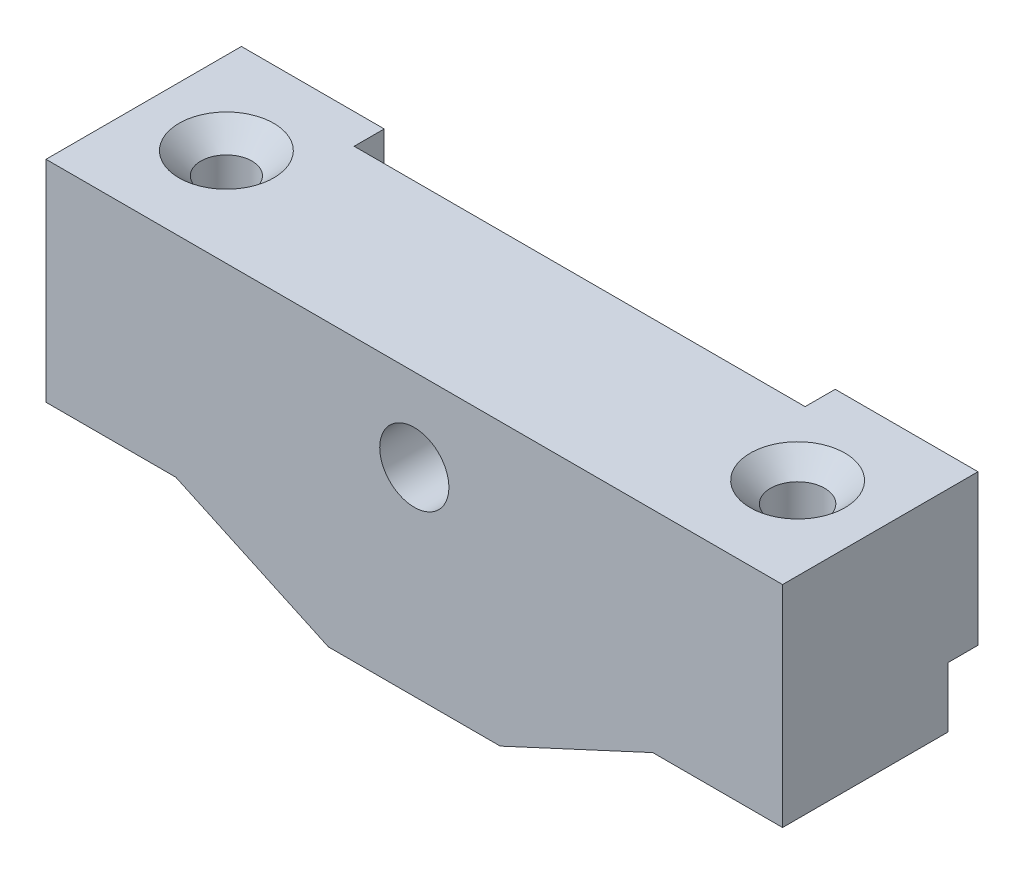
ISO-10303-21;
HEADER;
FILE_DESCRIPTION(('STEP AP214'),'2;1');
FILE_NAME('part.step','',(''),(''),'','','');
FILE_SCHEMA(('AUTOMOTIVE_DESIGN { 1 0 10303 214 1 1 1 1 }'));
ENDSEC;
DATA;
#1=APPLICATION_CONTEXT('core data for automotive mechanical design processes');
#2=APPLICATION_PROTOCOL_DEFINITION('international standard','automotive_design',2000,#1);
#3=PRODUCT_CONTEXT('',#1,'mechanical');
#4=PRODUCT('Part','Part','',(#3));
#5=PRODUCT_RELATED_PRODUCT_CATEGORY('part','',(#4));
#6=PRODUCT_DEFINITION_FORMATION('','',#4);
#7=PRODUCT_DEFINITION_CONTEXT('part definition',#1,'design');
#8=PRODUCT_DEFINITION('design','',#6,#7);
#9=PRODUCT_DEFINITION_SHAPE('','',#8);
#10=(LENGTH_UNIT() NAMED_UNIT(*) SI_UNIT(.MILLI.,.METRE.));
#11=(NAMED_UNIT(*) PLANE_ANGLE_UNIT() SI_UNIT($,.RADIAN.));
#12=(NAMED_UNIT(*) SI_UNIT($,.STERADIAN.) SOLID_ANGLE_UNIT());
#13=UNCERTAINTY_MEASURE_WITH_UNIT(LENGTH_MEASURE(1.E-05),#10,'distance_accuracy_value','');
#14=(GEOMETRIC_REPRESENTATION_CONTEXT(3) GLOBAL_UNCERTAINTY_ASSIGNED_CONTEXT((#13)) GLOBAL_UNIT_ASSIGNED_CONTEXT((#10,
#11,#12)) REPRESENTATION_CONTEXT('',''));
#15=CARTESIAN_POINT('',(0.,0.,0.));
#16=DIRECTION('',(0.,0.,1.));
#17=DIRECTION('',(1.,0.,0.));
#18=AXIS2_PLACEMENT_3D('',#15,#16,#17);
#19=CARTESIAN_POINT('',(-0.517812882603344,32.9754940311279,7.));
#20=DIRECTION('',(0.,1.,0.));
#21=DIRECTION('',(0.,0.,1.));
#22=AXIS2_PLACEMENT_3D('',#19,#20,#21);
#23=PLANE('',#22);
#24=CARTESIAN_POINT('',(-0.517812882603344,32.9754940311279,7.));
#25=DIRECTION('',(0.,1.,0.));
#26=DIRECTION('',(0.,0.,1.));
#27=AXIS2_PLACEMENT_3D('',#24,#25,#26);
#28=CIRCLE('',#27,1.7);
#29=CARTESIAN_POINT('',(-0.517812882603344,32.9754940311279,8.7));
#30=VERTEX_POINT('',#29);
#31=EDGE_CURVE('E45',#30,#30,#28,.T.);
#32=ORIENTED_EDGE('',*,*,#31,.T.);
#33=EDGE_LOOP('',(#32));
#34=FACE_BOUND('',#33,.T.);
#35=CARTESIAN_POINT('',(-0.517812882603344,32.9754940311279,7.));
#36=DIRECTION('',(0.,1.,0.));
#37=DIRECTION('',(0.,0.,1.));
#38=AXIS2_PLACEMENT_3D('',#35,#36,#37);
#39=CIRCLE('',#38,2.55);
#40=CARTESIAN_POINT('',(-0.517812882603344,32.9754940311279,9.55));
#41=VERTEX_POINT('',#40);
#42=EDGE_CURVE('E173',#41,#41,#39,.F.);
#43=ORIENTED_EDGE('',*,*,#42,.T.);
#44=EDGE_LOOP('',(#43));
#45=FACE_BOUND('',#44,.T.);
#46=ADVANCED_FACE('F41',(#34,#45),#23,.F.);
#47=CARTESIAN_POINT('',(37.4821871173967,32.9754940311279,7.));
#48=DIRECTION('',(0.,1.,0.));
#49=DIRECTION('',(0.,0.,1.));
#50=AXIS2_PLACEMENT_3D('',#47,#48,#49);
#51=PLANE('',#50);
#52=CARTESIAN_POINT('',(37.4821871173967,32.9754940311279,7.));
#53=DIRECTION('',(0.,1.,0.));
#54=DIRECTION('',(0.,0.,1.));
#55=AXIS2_PLACEMENT_3D('',#52,#53,#54);
#56=CIRCLE('',#55,1.8);
#57=CARTESIAN_POINT('',(37.4821871173967,32.9754940311279,8.8));
#58=VERTEX_POINT('',#57);
#59=EDGE_CURVE('E227',#58,#58,#56,.T.);
#60=ORIENTED_EDGE('',*,*,#59,.T.);
#61=EDGE_LOOP('',(#60));
#62=FACE_BOUND('',#61,.T.);
#63=CARTESIAN_POINT('',(37.4821871173967,32.9754940311279,7.));
#64=DIRECTION('',(0.,1.,0.));
#65=DIRECTION('',(0.,0.,1.));
#66=AXIS2_PLACEMENT_3D('',#63,#64,#65);
#67=CIRCLE('',#66,2.7);
#68=CARTESIAN_POINT('',(37.4821871173967,32.9754940311279,4.3));
#69=VERTEX_POINT('',#68);
#70=EDGE_CURVE('E270',#69,#69,#67,.F.);
#71=ORIENTED_EDGE('',*,*,#70,.T.);
#72=EDGE_LOOP('',(#71));
#73=FACE_BOUND('',#72,.T.);
#74=ADVANCED_FACE('F307',(#62,#73),#51,.F.);
#75=CARTESIAN_POINT('',(-6.01781288260334,36.9754940311279,0.499999999999994));
#76=DIRECTION('',(0.,0.,1.));
#77=DIRECTION('',(1.,0.,0.));
#78=AXIS2_PLACEMENT_3D('',#75,#76,#77);
#79=PLANE('',#78);
#80=DIRECTION('',(0.907399459865731,0.420269223516759,0.));
#81=VECTOR('',#80,1.);
#82=CARTESIAN_POINT('',(23.9821871173967,18.1754940311279,0.499999999999994));
#83=LINE('',#82,#81);
#84=CARTESIAN_POINT('',(33.4821871173967,22.5754940311279,0.499999999999993));
#85=VERTEX_POINT('',#84);
#86=CARTESIAN_POINT('',(42.9821871173967,26.9754940311279,0.499999999999994));
#87=VERTEX_POINT('',#86);
#88=EDGE_CURVE('E242',#85,#87,#83,.T.);
#89=ORIENTED_EDGE('',*,*,#88,.F.);
#90=DIRECTION('',(0.,-1.,0.));
#91=VECTOR('',#90,1.);
#92=CARTESIAN_POINT('',(33.4821871173967,22.5754940311279,0.499999999999993));
#93=LINE('',#92,#91);
#94=CARTESIAN_POINT('',(33.4821871173967,36.9754940311279,0.499999999999993));
#95=VERTEX_POINT('',#94);
#96=EDGE_CURVE('E213',#95,#85,#93,.T.);
#97=ORIENTED_EDGE('',*,*,#96,.F.);
#98=DIRECTION('',(-1.,0.,0.));
#99=VECTOR('',#98,1.);
#100=CARTESIAN_POINT('',(-6.01781288260334,36.9754940311279,0.499999999999994));
#101=LINE('',#100,#99);
#102=CARTESIAN_POINT('',(42.9821871173967,36.9754940311279,0.499999999999994));
#103=VERTEX_POINT('',#102);
#104=EDGE_CURVE('E240',#103,#95,#101,.T.);
#105=ORIENTED_EDGE('',*,*,#104,.F.);
#106=DIRECTION('',(0.,-1.,0.));
#107=VECTOR('',#106,1.);
#108=CARTESIAN_POINT('',(42.9821871173967,36.9754940311279,0.499999999999994));
#109=LINE('',#108,#107);
#110=EDGE_CURVE('E244',#103,#87,#109,.T.);
#111=ORIENTED_EDGE('',*,*,#110,.T.);
#112=EDGE_LOOP('',(#89,#97,#105,#111));
#113=FACE_BOUND('',#112,.T.);
#114=ADVANCED_FACE('F314',(#113),#79,.F.);
#115=CARTESIAN_POINT('',(37.4821871173967,36.9754940311279,7.));
#116=DIRECTION('',(0.,-1.,0.));
#117=DIRECTION('',(0.,0.,-1.));
#118=AXIS2_PLACEMENT_3D('',#115,#116,#117);
#119=CYLINDRICAL_SURFACE('',#118,2.7);
#120=CARTESIAN_POINT('',(37.4821871173967,22.9754940311279,7.));
#121=DIRECTION('',(0.,-1.,0.));
#122=DIRECTION('',(0.,0.,-1.));
#123=AXIS2_PLACEMENT_3D('',#120,#121,#122);
#124=CIRCLE('',#123,2.7);
#125=CARTESIAN_POINT('',(37.4821871173967,22.9754940311279,4.3));
#126=VERTEX_POINT('',#125);
#127=EDGE_CURVE('E151',#126,#126,#124,.T.);
#128=CARTESIAN_POINT('',(37.4821871173967,22.9754940311279,4.3));
#129=CARTESIAN_POINT('',(37.4821871173967,23.0796606977946,4.3));
#130=CARTESIAN_POINT('',(37.4821871173967,23.1838273644612,4.3));
#131=CARTESIAN_POINT('',(37.4821871173967,23.3921606977946,4.3));
#132=CARTESIAN_POINT('',(37.4821871173967,23.4963273644612,4.3));
#133=CARTESIAN_POINT('',(37.4821871173967,23.7046606977946,4.3));
#134=CARTESIAN_POINT('',(37.4821871173967,23.8088273644612,4.3));
#135=CARTESIAN_POINT('',(37.4821871173967,24.0171606977946,4.3));
#136=CARTESIAN_POINT('',(37.4821871173967,24.1213273644612,4.3));
#137=CARTESIAN_POINT('',(37.4821871173967,24.3296606977946,4.3));
#138=CARTESIAN_POINT('',(37.4821871173967,24.4338273644612,4.3));
#139=CARTESIAN_POINT('',(37.4821871173967,24.6421606977946,4.3));
#140=CARTESIAN_POINT('',(37.4821871173967,24.7463273644612,4.3));
#141=CARTESIAN_POINT('',(37.4821871173967,24.9546606977946,4.3));
#142=CARTESIAN_POINT('',(37.4821871173967,25.0588273644612,4.3));
#143=CARTESIAN_POINT('',(37.4821871173967,25.2671606977946,4.3));
#144=CARTESIAN_POINT('',(37.4821871173967,25.3713273644612,4.3));
#145=CARTESIAN_POINT('',(37.4821871173967,25.5796606977946,4.3));
#146=CARTESIAN_POINT('',(37.4821871173967,25.6838273644612,4.3));
#147=CARTESIAN_POINT('',(37.4821871173967,25.8921606977946,4.3));
#148=CARTESIAN_POINT('',(37.4821871173967,25.9963273644612,4.3));
#149=CARTESIAN_POINT('',(37.4821871173967,26.2046606977946,4.3));
#150=CARTESIAN_POINT('',(37.4821871173967,26.3088273644612,4.3));
#151=CARTESIAN_POINT('',(37.4821871173967,26.5171606977946,4.3));
#152=CARTESIAN_POINT('',(37.4821871173967,26.6213273644612,4.3));
#153=CARTESIAN_POINT('',(37.4821871173967,26.8296606977946,4.3));
#154=CARTESIAN_POINT('',(37.4821871173967,26.9338273644612,4.3));
#155=CARTESIAN_POINT('',(37.4821871173967,27.1421606977946,4.3));
#156=CARTESIAN_POINT('',(37.4821871173967,27.2463273644612,4.3));
#157=CARTESIAN_POINT('',(37.4821871173967,27.4546606977946,4.3));
#158=CARTESIAN_POINT('',(37.4821871173967,27.5588273644612,4.3));
#159=CARTESIAN_POINT('',(37.4821871173967,27.7671606977946,4.3));
#160=CARTESIAN_POINT('',(37.4821871173967,27.8713273644612,4.3));
#161=CARTESIAN_POINT('',(37.4821871173967,28.0796606977946,4.3));
#162=CARTESIAN_POINT('',(37.4821871173967,28.1838273644612,4.3));
#163=CARTESIAN_POINT('',(37.4821871173967,28.3921606977946,4.3));
#164=CARTESIAN_POINT('',(37.4821871173967,28.4963273644612,4.3));
#165=CARTESIAN_POINT('',(37.4821871173967,28.7046606977946,4.3));
#166=CARTESIAN_POINT('',(37.4821871173967,28.8088273644612,4.3));
#167=CARTESIAN_POINT('',(37.4821871173967,29.0171606977946,4.3));
#168=CARTESIAN_POINT('',(37.4821871173967,29.1213273644612,4.3));
#169=CARTESIAN_POINT('',(37.4821871173967,29.3296606977946,4.3));
#170=CARTESIAN_POINT('',(37.4821871173967,29.4338273644612,4.3));
#171=CARTESIAN_POINT('',(37.4821871173967,29.6421606977946,4.3));
#172=CARTESIAN_POINT('',(37.4821871173967,29.7463273644612,4.3));
#173=CARTESIAN_POINT('',(37.4821871173967,29.9546606977946,4.3));
#174=CARTESIAN_POINT('',(37.4821871173967,30.0588273644612,4.3));
#175=CARTESIAN_POINT('',(37.4821871173967,30.2671606977946,4.3));
#176=CARTESIAN_POINT('',(37.4821871173967,30.3713273644612,4.3));
#177=CARTESIAN_POINT('',(37.4821871173967,30.5796606977946,4.3));
#178=CARTESIAN_POINT('',(37.4821871173967,30.6838273644612,4.3));
#179=CARTESIAN_POINT('',(37.4821871173967,30.8921606977946,4.3));
#180=CARTESIAN_POINT('',(37.4821871173967,30.9963273644612,4.3));
#181=CARTESIAN_POINT('',(37.4821871173967,31.2046606977946,4.3));
#182=CARTESIAN_POINT('',(37.4821871173967,31.3088273644612,4.3));
#183=CARTESIAN_POINT('',(37.4821871173967,31.5171606977946,4.3));
#184=CARTESIAN_POINT('',(37.4821871173967,31.6213273644612,4.3));
#185=CARTESIAN_POINT('',(37.4821871173967,31.8296606977946,4.3));
#186=CARTESIAN_POINT('',(37.4821871173967,31.9338273644612,4.3));
#187=CARTESIAN_POINT('',(37.4821871173967,32.1421606977946,4.3));
#188=CARTESIAN_POINT('',(37.4821871173967,32.2463273644612,4.3));
#189=CARTESIAN_POINT('',(37.4821871173967,32.4546606977946,4.3));
#190=CARTESIAN_POINT('',(37.4821871173967,32.5588273644612,4.3));
#191=CARTESIAN_POINT('',(37.4821871173967,32.7671606977946,4.3));
#192=CARTESIAN_POINT('',(37.4821871173967,32.8713273644612,4.3));
#193=CARTESIAN_POINT('',(37.4821871173967,32.9754940311279,4.3));
#194=B_SPLINE_CURVE_WITH_KNOTS('',3,(#128,#129,#130,#131,#132,#133,#134,#135,#136,#137,#138,
#139,#140,#141,#142,#143,#144,#145,#146,#147,#148,#149,#150,#151,#152,#153,#154,#155,#156,#157,
#158,#159,#160,#161,#162,#163,#164,#165,#166,#167,#168,#169,#170,#171,#172,#173,#174,#175,#176,
#177,#178,#179,#180,#181,#182,#183,#184,#185,#186,#187,#188,#189,#190,#191,#192,#193),
.UNSPECIFIED.,.F.,.F.,(4,2,2,2,2,2,2,2,2,2,2,2,2,2,2,2,2,2,2,2,2,2,2,2,2,2,2,2,2,2,2,2,4),(0.,
0.3125,0.625000000000001,0.937500000000001,1.25,1.5625,1.875,2.1875,2.5,2.8125,3.125,3.4375,
3.75,4.0625,4.375,4.6875,5.,5.3125,5.625,5.9375,6.25,6.5625,6.875,7.1875,7.5,7.8125,8.125,
8.4375,8.75,9.0625,9.37499999999999,9.68749999999999,9.99999999999999),.UNSPECIFIED.);
#195=EDGE_CURVE('BSEAM289',#126,#69,#194,.T.);
#196=ORIENTED_EDGE('',*,*,#127,.T.);
#197=ORIENTED_EDGE('',*,*,#70,.F.);
#198=ORIENTED_EDGE('',*,*,#195,.T.);
#199=ORIENTED_EDGE('',*,*,#195,.F.);
#200=EDGE_LOOP('',(#196,#198,#197,#199));
#201=FACE_BOUND('',#200,.T.);
#202=ADVANCED_FACE('F289',(#201),#119,.F.);
#203=CARTESIAN_POINT('',(42.9821871173967,36.9754940311279,14.));
#204=DIRECTION('',(0.,-1.,0.));
#205=DIRECTION('',(0.,0.,-1.));
#206=AXIS2_PLACEMENT_3D('',#203,#204,#205);
#207=PLANE('',#206);
#208=CARTESIAN_POINT('',(-0.517812882603344,36.9754940311279,7.));
#209=DIRECTION('',(0.,1.,0.));
#210=DIRECTION('',(0.,0.,1.));
#211=AXIS2_PLACEMENT_3D('',#208,#209,#210);
#212=CIRCLE('',#211,3.15);
#213=CARTESIAN_POINT('',(-0.517812882603344,36.9754940311279,10.15));
#214=VERTEX_POINT('',#213);
#215=EDGE_CURVE('E610',#214,#214,#212,.T.);
#216=ORIENTED_EDGE('',*,*,#215,.F.);
#217=EDGE_LOOP('',(#216));
#218=FACE_BOUND('',#217,.T.);
#219=CARTESIAN_POINT('',(37.4821871173967,36.9754940311279,7.));
#220=DIRECTION('',(0.,1.,0.));
#221=DIRECTION('',(0.,0.,1.));
#222=AXIS2_PLACEMENT_3D('',#219,#220,#221);
#223=CIRCLE('',#222,3.15);
#224=CARTESIAN_POINT('',(37.4821871173967,36.9754940311279,10.15));
#225=VERTEX_POINT('',#224);
#226=EDGE_CURVE('E271',#225,#225,#223,.T.);
#227=ORIENTED_EDGE('',*,*,#226,.F.);
#228=EDGE_LOOP('',(#227));
#229=FACE_BOUND('',#228,.T.);
#230=CARTESIAN_POINT('',(3.48218711739666,36.9754940311279,0.499999999999994));
#231=VERTEX_POINT('',#230);
#232=CARTESIAN_POINT('',(-6.01781288260334,36.9754940311279,0.499999999999994));
#233=VERTEX_POINT('',#232);
#234=EDGE_CURVE('E247',#231,#233,#101,.T.);
#235=ORIENTED_EDGE('',*,*,#234,.T.);
#236=DIRECTION('',(0.,0.,-1.));
#237=VECTOR('',#236,1.);
#238=CARTESIAN_POINT('',(-6.01781288260334,36.9754940311279,14.));
#239=LINE('',#238,#237);
#240=CARTESIAN_POINT('',(-6.01781288260334,36.9754940311279,13.5));
#241=VERTEX_POINT('',#240);
#242=EDGE_CURVE('E266',#241,#233,#239,.T.);
#243=ORIENTED_EDGE('',*,*,#242,.F.);
#244=DIRECTION('',(1.,0.,0.));
#245=VECTOR('',#244,1.);
#246=CARTESIAN_POINT('',(-6.01781288260334,36.9754940311279,13.5));
#247=LINE('',#246,#245);
#248=CARTESIAN_POINT('',(42.9821871173967,36.9754940311279,13.5));
#249=VERTEX_POINT('',#248);
#250=EDGE_CURVE('E237',#241,#249,#247,.T.);
#251=ORIENTED_EDGE('',*,*,#250,.T.);
#252=DIRECTION('',(0.,0.,-1.));
#253=VECTOR('',#252,1.);
#254=CARTESIAN_POINT('',(42.9821871173967,36.9754940311279,14.));
#255=LINE('',#254,#253);
#256=EDGE_CURVE('E50',#249,#103,#255,.T.);
#257=ORIENTED_EDGE('',*,*,#256,.T.);
#258=ORIENTED_EDGE('',*,*,#104,.T.);
#259=DIRECTION('',(0.,0.,-1.));
#260=VECTOR('',#259,1.);
#261=CARTESIAN_POINT('',(33.4821871173967,36.9754940311279,2.49999999999999));
#262=LINE('',#261,#260);
#263=CARTESIAN_POINT('',(33.4821871173967,36.9754940311279,2.49999999999999));
#264=VERTEX_POINT('',#263);
#265=EDGE_CURVE('E228',#264,#95,#262,.T.);
#266=ORIENTED_EDGE('',*,*,#265,.F.);
#267=DIRECTION('',(1.,0.,0.));
#268=VECTOR('',#267,1.);
#269=CARTESIAN_POINT('',(33.4821871173967,36.9754940311279,2.49999999999999));
#270=LINE('',#269,#268);
#271=CARTESIAN_POINT('',(3.48218711739666,36.9754940311279,2.49999999999999));
#272=VERTEX_POINT('',#271);
#273=EDGE_CURVE('E217',#272,#264,#270,.T.);
#274=ORIENTED_EDGE('',*,*,#273,.F.);
#275=DIRECTION('',(0.,0.,-1.));
#276=VECTOR('',#275,1.);
#277=CARTESIAN_POINT('',(3.48218711739666,36.9754940311279,2.49999999999999));
#278=LINE('',#277,#276);
#279=EDGE_CURVE('E230',#272,#231,#278,.T.);
#280=ORIENTED_EDGE('',*,*,#279,.T.);
#281=EDGE_LOOP('',(#235,#243,#251,#257,#258,#266,#274,#280));
#282=FACE_BOUND('',#281,.T.);
#283=ADVANCED_FACE('F337',(#218,#229,#282),#207,.F.);
#284=CARTESIAN_POINT('',(-6.01781288260334,26.9754940311279,14.));
#285=DIRECTION('',(0.420269223516759,0.907399459865731,0.));
#286=DIRECTION('',(-0.907399459865731,0.420269223516759,0.));
#287=AXIS2_PLACEMENT_3D('',#284,#285,#286);
#288=PLANE('',#287);
#289=DIRECTION('',(0.,0.,1.));
#290=VECTOR('',#289,1.);
#291=CARTESIAN_POINT('',(2.61855075376029,22.9754940311279,14.));
#292=LINE('',#291,#290);
#293=CARTESIAN_POINT('',(2.61855075376029,22.9754940311279,2.49999999999999));
#294=VERTEX_POINT('',#293);
#295=CARTESIAN_POINT('',(2.61855075376029,22.9754940311279,13.5));
#296=VERTEX_POINT('',#295);
#297=EDGE_CURVE('E58',#294,#296,#292,.T.);
#298=ORIENTED_EDGE('',*,*,#297,.F.);
#299=DIRECTION('',(-0.907399459865731,0.420269223516759,0.));
#300=VECTOR('',#299,1.);
#301=CARTESIAN_POINT('',(-6.01781288260334,26.9754940311279,2.49999999999999));
#302=LINE('',#301,#300);
#303=CARTESIAN_POINT('',(-6.01781288260334,26.9754940311279,2.49999999999999));
#304=VERTEX_POINT('',#303);
#305=EDGE_CURVE('E62',#294,#304,#302,.T.);
#306=ORIENTED_EDGE('',*,*,#305,.T.);
#307=DIRECTION('',(0.,0.,-1.));
#308=VECTOR('',#307,1.);
#309=CARTESIAN_POINT('',(-6.01781288260334,26.9754940311279,14.));
#310=LINE('',#309,#308);
#311=CARTESIAN_POINT('',(-6.01781288260334,26.9754940311279,0.499999999999994));
#312=VERTEX_POINT('',#311);
#313=EDGE_CURVE('E264',#304,#312,#310,.T.);
#314=ORIENTED_EDGE('',*,*,#313,.T.);
#315=DIRECTION('',(0.907399459865731,-0.420269223516759,0.));
#316=VECTOR('',#315,1.);
#317=CARTESIAN_POINT('',(-6.01781288260334,26.9754940311279,0.499999999999994));
#318=LINE('',#317,#316);
#319=CARTESIAN_POINT('',(3.48218711739666,22.5754940311279,0.499999999999994));
#320=VERTEX_POINT('',#319);
#321=EDGE_CURVE('E254',#312,#320,#318,.T.);
#322=ORIENTED_EDGE('',*,*,#321,.T.);
#323=DIRECTION('',(0.,0.,-1.));
#324=VECTOR('',#323,1.);
#325=CARTESIAN_POINT('',(3.48218711739666,22.5754940311279,2.49999999999999));
#326=LINE('',#325,#324);
#327=CARTESIAN_POINT('',(3.48218711739666,22.5754940311279,2.49999999999999));
#328=VERTEX_POINT('',#327);
#329=EDGE_CURVE('E221',#328,#320,#326,.T.);
#330=ORIENTED_EDGE('',*,*,#329,.F.);
#331=DIRECTION('',(-0.907399459865731,0.42026922351676,0.));
#332=VECTOR('',#331,1.);
#333=CARTESIAN_POINT('',(3.48218711739666,22.5754940311279,2.49999999999999));
#334=LINE('',#333,#332);
#335=CARTESIAN_POINT('',(12.7662780264876,18.2754940311279,2.49999999999999));
#336=VERTEX_POINT('',#335);
#337=EDGE_CURVE('E212',#336,#328,#334,.T.);
#338=ORIENTED_EDGE('',*,*,#337,.F.);
#339=DIRECTION('',(0.,0.,-1.));
#340=VECTOR('',#339,1.);
#341=CARTESIAN_POINT('',(12.7662780264876,18.2754940311279,24.5));
#342=LINE('',#341,#340);
#343=CARTESIAN_POINT('',(12.7662780264876,18.2754940311279,13.5));
#344=VERTEX_POINT('',#343);
#345=EDGE_CURVE('E192',#344,#336,#342,.T.);
#346=ORIENTED_EDGE('',*,*,#345,.F.);
#347=DIRECTION('',(-0.907399459865731,0.420269223516759,0.));
#348=VECTOR('',#347,1.);
#349=CARTESIAN_POINT('',(-6.01781288260334,26.9754940311279,13.5));
#350=LINE('',#349,#348);
#351=EDGE_CURVE('E259',#344,#296,#350,.T.);
#352=ORIENTED_EDGE('',*,*,#351,.T.);
#353=EDGE_LOOP('',(#298,#306,#314,#322,#330,#338,#346,#352));
#354=FACE_BOUND('',#353,.T.);
#355=ADVANCED_FACE('F43',(#354),#288,.F.);
#356=CARTESIAN_POINT('',(23.9821871173967,18.1754940311279,14.));
#357=DIRECTION('',(-0.420269223516759,0.907399459865731,0.));
#358=DIRECTION('',(-0.907399459865731,-0.420269223516759,0.));
#359=AXIS2_PLACEMENT_3D('',#356,#357,#358);
#360=PLANE('',#359);
#361=DIRECTION('',(0.,0.,-1.));
#362=VECTOR('',#361,1.);
#363=CARTESIAN_POINT('',(42.9821871173967,26.9754940311279,14.));
#364=LINE('',#363,#362);
#365=CARTESIAN_POINT('',(42.9821871173967,26.9754940311279,2.49999999999999));
#366=VERTEX_POINT('',#365);
#367=EDGE_CURVE('E11',#366,#87,#364,.T.);
#368=ORIENTED_EDGE('',*,*,#367,.F.);
#369=DIRECTION('',(-0.907399459865731,-0.420269223516759,0.));
#370=VECTOR('',#369,1.);
#371=CARTESIAN_POINT('',(23.9821871173967,18.1754940311279,2.49999999999999));
#372=LINE('',#371,#370);
#373=CARTESIAN_POINT('',(34.345823481033,22.9754940311279,2.49999999999999));
#374=VERTEX_POINT('',#373);
#375=EDGE_CURVE('E156',#366,#374,#372,.T.);
#376=ORIENTED_EDGE('',*,*,#375,.T.);
#377=DIRECTION('',(0.,0.,1.));
#378=VECTOR('',#377,1.);
#379=CARTESIAN_POINT('',(34.345823481033,22.9754940311279,14.));
#380=LINE('',#379,#378);
#381=CARTESIAN_POINT('',(34.345823481033,22.9754940311279,13.5));
#382=VERTEX_POINT('',#381);
#383=EDGE_CURVE('E148',#374,#382,#380,.T.);
#384=ORIENTED_EDGE('',*,*,#383,.T.);
#385=DIRECTION('',(-0.907399459865731,-0.420269223516759,0.));
#386=VECTOR('',#385,1.);
#387=CARTESIAN_POINT('',(23.9821871173967,18.1754940311279,13.5));
#388=LINE('',#387,#386);
#389=CARTESIAN_POINT('',(24.1980962083057,18.2754940311279,13.5));
#390=VERTEX_POINT('',#389);
#391=EDGE_CURVE('E257',#382,#390,#388,.T.);
#392=ORIENTED_EDGE('',*,*,#391,.T.);
#393=DIRECTION('',(0.,0.,-1.));
#394=VECTOR('',#393,1.);
#395=CARTESIAN_POINT('',(24.1980962083057,18.2754940311279,24.5));
#396=LINE('',#395,#394);
#397=CARTESIAN_POINT('',(24.1980962083057,18.2754940311279,2.49999999999999));
#398=VERTEX_POINT('',#397);
#399=EDGE_CURVE('E193',#390,#398,#396,.T.);
#400=ORIENTED_EDGE('',*,*,#399,.T.);
#401=DIRECTION('',(-0.907399459865731,-0.42026922351676,0.));
#402=VECTOR('',#401,1.);
#403=CARTESIAN_POINT('',(33.4821871173967,22.5754940311279,2.49999999999999));
#404=LINE('',#403,#402);
#405=CARTESIAN_POINT('',(33.4821871173967,22.5754940311279,2.49999999999999));
#406=VERTEX_POINT('',#405);
#407=EDGE_CURVE('E209',#406,#398,#404,.T.);
#408=ORIENTED_EDGE('',*,*,#407,.F.);
#409=DIRECTION('',(0.,0.,-1.));
#410=VECTOR('',#409,1.);
#411=CARTESIAN_POINT('',(33.4821871173967,22.5754940311279,2.49999999999999));
#412=LINE('',#411,#410);
#413=EDGE_CURVE('E224',#406,#85,#412,.T.);
#414=ORIENTED_EDGE('',*,*,#413,.T.);
#415=ORIENTED_EDGE('',*,*,#88,.T.);
#416=EDGE_LOOP('',(#368,#376,#384,#392,#400,#408,#414,#415));
#417=FACE_BOUND('',#416,.T.);
#418=ADVANCED_FACE('F354',(#417),#360,.F.);
#419=CARTESIAN_POINT('',(42.9821871173967,26.9754940311279,14.));
#420=DIRECTION('',(-1.,0.,0.));
#421=DIRECTION('',(0.,0.,1.));
#422=AXIS2_PLACEMENT_3D('',#419,#420,#421);
#423=PLANE('',#422);
#424=ORIENTED_EDGE('',*,*,#110,.F.);
#425=ORIENTED_EDGE('',*,*,#256,.F.);
#426=DIRECTION('',(0.,-1.,0.));
#427=VECTOR('',#426,1.);
#428=CARTESIAN_POINT('',(42.9821871173967,36.9754940311279,13.5));
#429=LINE('',#428,#427);
#430=CARTESIAN_POINT('',(42.9821871173967,22.9754940311279,13.5));
#431=VERTEX_POINT('',#430);
#432=EDGE_CURVE('E165',#249,#431,#429,.T.);
#433=ORIENTED_EDGE('',*,*,#432,.T.);
#434=DIRECTION('',(0.,0.,1.));
#435=VECTOR('',#434,1.);
#436=CARTESIAN_POINT('',(42.9821871173967,22.9754940311279,2.49999999999999));
#437=LINE('',#436,#435);
#438=CARTESIAN_POINT('',(42.9821871173967,22.9754940311279,2.49999999999999));
#439=VERTEX_POINT('',#438);
#440=EDGE_CURVE('E145',#439,#431,#437,.T.);
#441=ORIENTED_EDGE('',*,*,#440,.F.);
#442=DIRECTION('',(0.,-1.,0.));
#443=VECTOR('',#442,1.);
#444=CARTESIAN_POINT('',(42.9821871173967,36.9754940311279,2.49999999999999));
#445=LINE('',#444,#443);
#446=EDGE_CURVE('E154',#366,#439,#445,.T.);
#447=ORIENTED_EDGE('',*,*,#446,.F.);
#448=ORIENTED_EDGE('',*,*,#367,.T.);
#449=EDGE_LOOP('',(#424,#425,#433,#441,#447,#448));
#450=FACE_BOUND('',#449,.T.);
#451=ADVANCED_FACE('F162',(#450),#423,.F.);
#452=CARTESIAN_POINT('',(-6.01781288260334,36.9754940311279,14.));
#453=DIRECTION('',(1.,0.,0.));
#454=DIRECTION('',(0.,1.,0.));
#455=AXIS2_PLACEMENT_3D('',#452,#453,#454);
#456=PLANE('',#455);
#457=ORIENTED_EDGE('',*,*,#313,.F.);
#458=DIRECTION('',(0.,-1.,0.));
#459=VECTOR('',#458,1.);
#460=CARTESIAN_POINT('',(-6.01781288260334,36.9754940311279,2.49999999999999));
#461=LINE('',#460,#459);
#462=CARTESIAN_POINT('',(-6.01781288260334,22.9754940311279,2.49999999999999));
#463=VERTEX_POINT('',#462);
#464=EDGE_CURVE('E170',#304,#463,#461,.T.);
#465=ORIENTED_EDGE('',*,*,#464,.T.);
#466=DIRECTION('',(0.,0.,-1.));
#467=VECTOR('',#466,1.);
#468=CARTESIAN_POINT('',(-6.01781288260334,22.9754940311279,2.49999999999999));
#469=LINE('',#468,#467);
#470=CARTESIAN_POINT('',(-6.01781288260334,22.9754940311279,13.5));
#471=VERTEX_POINT('',#470);
#472=EDGE_CURVE('E176',#471,#463,#469,.T.);
#473=ORIENTED_EDGE('',*,*,#472,.F.);
#474=DIRECTION('',(0.,-1.,0.));
#475=VECTOR('',#474,1.);
#476=CARTESIAN_POINT('',(-6.01781288260334,36.9754940311279,13.5));
#477=LINE('',#476,#475);
#478=EDGE_CURVE('E239',#241,#471,#477,.T.);
#479=ORIENTED_EDGE('',*,*,#478,.F.);
#480=ORIENTED_EDGE('',*,*,#242,.T.);
#481=DIRECTION('',(0.,-1.,0.));
#482=VECTOR('',#481,1.);
#483=CARTESIAN_POINT('',(-6.01781288260334,36.9754940311279,0.499999999999994));
#484=LINE('',#483,#482);
#485=EDGE_CURVE('E236',#233,#312,#484,.T.);
#486=ORIENTED_EDGE('',*,*,#485,.T.);
#487=EDGE_LOOP('',(#457,#465,#473,#479,#480,#486));
#488=FACE_BOUND('',#487,.T.);
#489=ADVANCED_FACE('F333',(#488),#456,.F.);
#490=ORIENTED_EDGE('',*,*,#234,.F.);
#491=DIRECTION('',(0.,1.,0.));
#492=VECTOR('',#491,1.);
#493=CARTESIAN_POINT('',(3.48218711739666,22.5754940311279,0.499999999999994));
#494=LINE('',#493,#492);
#495=EDGE_CURVE('E208',#320,#231,#494,.T.);
#496=ORIENTED_EDGE('',*,*,#495,.F.);
#497=ORIENTED_EDGE('',*,*,#321,.F.);
#498=ORIENTED_EDGE('',*,*,#485,.F.);
#499=EDGE_LOOP('',(#490,#496,#497,#498));
#500=FACE_BOUND('',#499,.T.);
#501=ADVANCED_FACE('F329',(#500),#79,.F.);
#502=CARTESIAN_POINT('',(-6.01781288260334,36.9754940311279,13.5));
#503=DIRECTION('',(0.,0.,-1.));
#504=DIRECTION('',(-1.,0.,0.));
#505=AXIS2_PLACEMENT_3D('',#502,#503,#504);
#506=PLANE('',#505);
#507=ORIENTED_EDGE('',*,*,#432,.F.);
#508=ORIENTED_EDGE('',*,*,#250,.F.);
#509=ORIENTED_EDGE('',*,*,#478,.T.);
#510=DIRECTION('',(-1.,0.,0.));
#511=VECTOR('',#510,1.);
#512=CARTESIAN_POINT('',(-6.01781288260334,22.9754940311279,13.5));
#513=LINE('',#512,#511);
#514=EDGE_CURVE('E179',#296,#471,#513,.T.);
#515=ORIENTED_EDGE('',*,*,#514,.F.);
#516=ORIENTED_EDGE('',*,*,#351,.F.);
#517=DIRECTION('',(1.,0.,0.));
#518=VECTOR('',#517,1.);
#519=CARTESIAN_POINT('',(-6.01781288260334,18.2754940311279,13.5));
#520=LINE('',#519,#518);
#521=EDGE_CURVE('E202',#344,#390,#520,.T.);
#522=ORIENTED_EDGE('',*,*,#521,.T.);
#523=ORIENTED_EDGE('',*,*,#391,.F.);
#524=DIRECTION('',(-1.,0.,0.));
#525=VECTOR('',#524,1.);
#526=CARTESIAN_POINT('',(42.9821871173967,22.9754940311279,13.5));
#527=LINE('',#526,#525);
#528=EDGE_CURVE('E159',#431,#382,#527,.T.);
#529=ORIENTED_EDGE('',*,*,#528,.F.);
#530=EDGE_LOOP('',(#507,#508,#509,#515,#516,#522,#523,#529));
#531=FACE_BOUND('',#530,.T.);
#532=CARTESIAN_POINT('',(18.4821871173967,31.4754940311279,13.5));
#533=DIRECTION('',(0.,0.,-1.));
#534=DIRECTION('',(-1.,0.,0.));
#535=AXIS2_PLACEMENT_3D('',#532,#533,#534);
#536=CIRCLE('',#535,2.3);
#537=CARTESIAN_POINT('',(16.1821871173967,31.4754940311279,13.5));
#538=VERTEX_POINT('',#537);
#539=EDGE_CURVE('E196',#538,#538,#536,.T.);
#540=ORIENTED_EDGE('',*,*,#539,.T.);
#541=EDGE_LOOP('',(#540));
#542=FACE_BOUND('',#541,.T.);
#543=ADVANCED_FACE('F326',(#531,#542),#506,.F.);
#544=CARTESIAN_POINT('',(37.4821871173967,32.9754940311279,7.));
#545=DIRECTION('',(0.,1.,0.));
#546=DIRECTION('',(0.,0.,1.));
#547=AXIS2_PLACEMENT_3D('',#544,#545,#546);
#548=CYLINDRICAL_SURFACE('',#547,1.8);
#549=CARTESIAN_POINT('',(37.4821871173967,35.6254940311279,7.));
#550=DIRECTION('',(0.,1.,0.));
#551=DIRECTION('',(0.,0.,1.));
#552=AXIS2_PLACEMENT_3D('',#549,#550,#551);
#553=CIRCLE('',#552,1.8);
#554=CARTESIAN_POINT('',(37.4821871173967,35.6254940311279,8.8));
#555=VERTEX_POINT('',#554);
#556=EDGE_CURVE('E268',#555,#555,#553,.T.);
#557=ORIENTED_EDGE('',*,*,#556,.T.);
#558=EDGE_LOOP('',(#557));
#559=FACE_BOUND('',#558,.T.);
#560=ORIENTED_EDGE('',*,*,#59,.F.);
#561=EDGE_LOOP('',(#560));
#562=FACE_BOUND('',#561,.T.);
#563=ADVANCED_FACE('F322',(#559,#562),#548,.F.);
#564=CARTESIAN_POINT('',(33.4821871173967,22.5754940311279,2.49999999999999));
#565=DIRECTION('',(1.,0.,0.));
#566=DIRECTION('',(0.,0.,-1.));
#567=AXIS2_PLACEMENT_3D('',#564,#565,#566);
#568=PLANE('',#567);
#569=ORIENTED_EDGE('',*,*,#96,.T.);
#570=ORIENTED_EDGE('',*,*,#413,.F.);
#571=DIRECTION('',(0.,-1.,0.));
#572=VECTOR('',#571,1.);
#573=CARTESIAN_POINT('',(33.4821871173967,22.5754940311279,2.49999999999999));
#574=LINE('',#573,#572);
#575=EDGE_CURVE('E219',#264,#406,#574,.T.);
#576=ORIENTED_EDGE('',*,*,#575,.F.);
#577=ORIENTED_EDGE('',*,*,#265,.T.);
#578=EDGE_LOOP('',(#569,#570,#576,#577));
#579=FACE_BOUND('',#578,.T.);
#580=ADVANCED_FACE('F325',(#579),#568,.F.);
#581=CARTESIAN_POINT('',(3.48218711739666,22.5754940311279,2.49999999999999));
#582=DIRECTION('',(-1.,0.,0.));
#583=DIRECTION('',(0.,0.,1.));
#584=AXIS2_PLACEMENT_3D('',#581,#582,#583);
#585=PLANE('',#584);
#586=ORIENTED_EDGE('',*,*,#495,.T.);
#587=ORIENTED_EDGE('',*,*,#279,.F.);
#588=DIRECTION('',(0.,1.,0.));
#589=VECTOR('',#588,1.);
#590=CARTESIAN_POINT('',(3.48218711739666,22.5754940311279,2.49999999999999));
#591=LINE('',#590,#589);
#592=EDGE_CURVE('E215',#328,#272,#591,.T.);
#593=ORIENTED_EDGE('',*,*,#592,.F.);
#594=ORIENTED_EDGE('',*,*,#329,.T.);
#595=EDGE_LOOP('',(#586,#587,#593,#594));
#596=FACE_BOUND('',#595,.T.);
#597=ADVANCED_FACE('F319',(#596),#585,.F.);
#598=CARTESIAN_POINT('',(0.,0.,2.49999999999999));
#599=DIRECTION('',(0.,0.,-1.));
#600=DIRECTION('',(-1.,0.,0.));
#601=AXIS2_PLACEMENT_3D('',#598,#599,#600);
#602=PLANE('',#601);
#603=DIRECTION('',(1.,0.,0.));
#604=VECTOR('',#603,1.);
#605=CARTESIAN_POINT('',(24.1980962083057,18.2754940311279,2.49999999999999));
#606=LINE('',#605,#604);
#607=EDGE_CURVE('E190',#336,#398,#606,.T.);
#608=ORIENTED_EDGE('',*,*,#607,.F.);
#609=ORIENTED_EDGE('',*,*,#337,.T.);
#610=ORIENTED_EDGE('',*,*,#592,.T.);
#611=ORIENTED_EDGE('',*,*,#273,.T.);
#612=ORIENTED_EDGE('',*,*,#575,.T.);
#613=ORIENTED_EDGE('',*,*,#407,.T.);
#614=EDGE_LOOP('',(#608,#609,#610,#611,#612,#613));
#615=FACE_BOUND('',#614,.T.);
#616=CARTESIAN_POINT('',(18.4821871173967,31.4754940311279,2.49999999999999));
#617=DIRECTION('',(0.,0.,-1.));
#618=DIRECTION('',(-1.,0.,0.));
#619=AXIS2_PLACEMENT_3D('',#616,#617,#618);
#620=CIRCLE('',#619,2.3);
#621=CARTESIAN_POINT('',(16.1821871173967,31.4754940311279,2.49999999999999));
#622=VERTEX_POINT('',#621);
#623=EDGE_CURVE('E189',#622,#622,#620,.T.);
#624=ORIENTED_EDGE('',*,*,#623,.F.);
#625=EDGE_LOOP('',(#624));
#626=FACE_BOUND('',#625,.T.);
#627=ADVANCED_FACE('F396',(#615,#626),#602,.T.);
#628=CARTESIAN_POINT('',(18.4821871173967,31.4754940311279,24.5));
#629=DIRECTION('',(0.,0.,-1.));
#630=DIRECTION('',(-1.,0.,0.));
#631=AXIS2_PLACEMENT_3D('',#628,#629,#630);
#632=CYLINDRICAL_SURFACE('',#631,2.3);
#633=ORIENTED_EDGE('',*,*,#623,.T.);
#634=EDGE_LOOP('',(#633));
#635=FACE_BOUND('',#634,.T.);
#636=ORIENTED_EDGE('',*,*,#539,.F.);
#637=EDGE_LOOP('',(#636));
#638=FACE_BOUND('',#637,.T.);
#639=ADVANCED_FACE('F407',(#635,#638),#632,.F.);
#640=CARTESIAN_POINT('',(24.1980962083057,18.2754940311279,24.5));
#641=DIRECTION('',(0.,1.,0.));
#642=DIRECTION('',(0.,0.,1.));
#643=AXIS2_PLACEMENT_3D('',#640,#641,#642);
#644=PLANE('',#643);
#645=ORIENTED_EDGE('',*,*,#345,.T.);
#646=ORIENTED_EDGE('',*,*,#607,.T.);
#647=ORIENTED_EDGE('',*,*,#399,.F.);
#648=ORIENTED_EDGE('',*,*,#521,.F.);
#649=EDGE_LOOP('',(#645,#646,#647,#648));
#650=FACE_BOUND('',#649,.T.);
#651=CARTESIAN_POINT('',(18.4821871173967,18.2754940311279,7.));
#652=DIRECTION('',(0.,1.,0.));
#653=DIRECTION('',(0.,0.,1.));
#654=AXIS2_PLACEMENT_3D('',#651,#652,#653);
#655=CIRCLE('',#654,4.12500000000001);
#656=CARTESIAN_POINT('',(18.4821871173967,18.2754940311279,11.125));
#657=VERTEX_POINT('',#656);
#658=EDGE_CURVE('E205',#657,#657,#655,.F.);
#659=ORIENTED_EDGE('',*,*,#658,.F.);
#660=EDGE_LOOP('',(#659));
#661=FACE_BOUND('',#660,.T.);
#662=ADVANCED_FACE('F342',(#650,#661),#644,.F.);
#663=CARTESIAN_POINT('',(18.4821871173967,26.9754940311279,7.));
#664=DIRECTION('',(0.,-1.,0.));
#665=DIRECTION('',(0.,0.,-1.));
#666=AXIS2_PLACEMENT_3D('',#663,#664,#665);
#667=PLANE('',#666);
#668=CARTESIAN_POINT('',(18.4821871173967,26.9754940311279,7.));
#669=DIRECTION('',(0.,-1.,0.));
#670=DIRECTION('',(0.,0.,-1.));
#671=AXIS2_PLACEMENT_3D('',#668,#669,#670);
#672=CIRCLE('',#671,4.12500000000001);
#673=CARTESIAN_POINT('',(18.4821871173967,26.9754940311279,2.87499999999999));
#674=VERTEX_POINT('',#673);
#675=EDGE_CURVE('E261',#674,#674,#672,.T.);
#676=ORIENTED_EDGE('',*,*,#675,.T.);
#677=EDGE_LOOP('',(#676));
#678=FACE_BOUND('',#677,.T.);
#679=ADVANCED_FACE('F338',(#678),#667,.T.);
#680=CARTESIAN_POINT('',(18.4821871173967,26.9754940311279,7.));
#681=DIRECTION('',(0.,-1.,0.));
#682=DIRECTION('',(0.,0.,-1.));
#683=AXIS2_PLACEMENT_3D('',#680,#681,#682);
#684=CYLINDRICAL_SURFACE('',#683,4.12500000000001);
#685=ORIENTED_EDGE('',*,*,#658,.T.);
#686=EDGE_LOOP('',(#685));
#687=FACE_BOUND('',#686,.T.);
#688=ORIENTED_EDGE('',*,*,#675,.F.);
#689=EDGE_LOOP('',(#688));
#690=FACE_BOUND('',#689,.T.);
#691=ADVANCED_FACE('F341',(#687,#690),#684,.F.);
#692=CARTESIAN_POINT('',(0.,22.9754940311279,0.));
#693=DIRECTION('',(0.,1.,0.));
#694=DIRECTION('',(0.,0.,1.));
#695=AXIS2_PLACEMENT_3D('',#692,#693,#694);
#696=PLANE('',#695);
#697=CARTESIAN_POINT('',(-0.517812882603344,22.9754940311279,7.));
#698=DIRECTION('',(0.,-1.,0.));
#699=DIRECTION('',(0.,0.,-1.));
#700=AXIS2_PLACEMENT_3D('',#697,#698,#699);
#701=CIRCLE('',#700,2.55);
#702=CARTESIAN_POINT('',(-0.517812882603344,22.9754940311279,4.45));
#703=VERTEX_POINT('',#702);
#704=EDGE_CURVE('E182',#703,#703,#701,.T.);
#705=ORIENTED_EDGE('',*,*,#704,.F.);
#706=EDGE_LOOP('',(#705));
#707=FACE_BOUND('',#706,.T.);
#708=DIRECTION('',(1.,0.,0.));
#709=VECTOR('',#708,1.);
#710=CARTESIAN_POINT('',(3.48218711739666,22.9754940311279,2.49999999999999));
#711=LINE('',#710,#709);
#712=EDGE_CURVE('E172',#463,#294,#711,.T.);
#713=ORIENTED_EDGE('',*,*,#712,.T.);
#714=ORIENTED_EDGE('',*,*,#297,.T.);
#715=ORIENTED_EDGE('',*,*,#514,.T.);
#716=ORIENTED_EDGE('',*,*,#472,.T.);
#717=EDGE_LOOP('',(#713,#714,#715,#716));
#718=FACE_BOUND('',#717,.T.);
#719=ADVANCED_FACE('F346',(#707,#718),#696,.F.);
#720=CARTESIAN_POINT('',(3.48218711739666,36.9754940311279,2.49999999999999));
#721=DIRECTION('',(0.,0.,-1.));
#722=DIRECTION('',(-1.,0.,0.));
#723=AXIS2_PLACEMENT_3D('',#720,#721,#722);
#724=PLANE('',#723);
#725=ORIENTED_EDGE('',*,*,#305,.F.);
#726=ORIENTED_EDGE('',*,*,#712,.F.);
#727=ORIENTED_EDGE('',*,*,#464,.F.);
#728=EDGE_LOOP('',(#725,#726,#727));
#729=FACE_BOUND('',#728,.T.);
#730=ADVANCED_FACE('F302',(#729),#724,.T.);
#731=CARTESIAN_POINT('',(-0.517812882603344,36.9754940311279,7.));
#732=DIRECTION('',(0.,-1.,0.));
#733=DIRECTION('',(0.,0.,-1.));
#734=AXIS2_PLACEMENT_3D('',#731,#732,#733);
#735=CYLINDRICAL_SURFACE('',#734,2.55);
#736=ORIENTED_EDGE('',*,*,#704,.T.);
#737=EDGE_LOOP('',(#736));
#738=FACE_BOUND('',#737,.T.);
#739=ORIENTED_EDGE('',*,*,#42,.F.);
#740=EDGE_LOOP('',(#739));
#741=FACE_BOUND('',#740,.T.);
#742=ADVANCED_FACE('F293',(#738,#741),#735,.F.);
#743=CARTESIAN_POINT('',(0.,22.9754940311279,0.));
#744=DIRECTION('',(0.,-1.,0.));
#745=DIRECTION('',(0.,0.,-1.));
#746=AXIS2_PLACEMENT_3D('',#743,#744,#745);
#747=PLANE('',#746);
#748=ORIENTED_EDGE('',*,*,#127,.F.);
#749=EDGE_LOOP('',(#748));
#750=FACE_BOUND('',#749,.T.);
#751=ORIENTED_EDGE('',*,*,#383,.F.);
#752=DIRECTION('',(1.,0.,0.));
#753=VECTOR('',#752,1.);
#754=CARTESIAN_POINT('',(33.4821871173967,22.9754940311279,2.49999999999999));
#755=LINE('',#754,#753);
#756=EDGE_CURVE('E141',#374,#439,#755,.T.);
#757=ORIENTED_EDGE('',*,*,#756,.T.);
#758=ORIENTED_EDGE('',*,*,#440,.T.);
#759=ORIENTED_EDGE('',*,*,#528,.T.);
#760=EDGE_LOOP('',(#751,#757,#758,#759));
#761=FACE_BOUND('',#760,.T.);
#762=ADVANCED_FACE('F143',(#750,#761),#747,.T.);
#763=CARTESIAN_POINT('',(33.4821871173967,36.9754940311279,2.49999999999999));
#764=DIRECTION('',(0.,0.,-1.));
#765=DIRECTION('',(-1.,0.,0.));
#766=AXIS2_PLACEMENT_3D('',#763,#764,#765);
#767=PLANE('',#766);
#768=ORIENTED_EDGE('',*,*,#375,.F.);
#769=ORIENTED_EDGE('',*,*,#446,.T.);
#770=ORIENTED_EDGE('',*,*,#756,.F.);
#771=EDGE_LOOP('',(#768,#769,#770));
#772=FACE_BOUND('',#771,.T.);
#773=ADVANCED_FACE('F155',(#772),#767,.T.);
#774=CARTESIAN_POINT('',(37.4821871173967,36.9754940311279,7.));
#775=DIRECTION('',(0.,1.,0.));
#776=DIRECTION('',(0.,0.,1.));
#777=AXIS2_PLACEMENT_3D('',#774,#775,#776);
#778=CONICAL_SURFACE('',#777,3.15,0.785398163397448);
#779=ORIENTED_EDGE('',*,*,#226,.T.);
#780=EDGE_LOOP('',(#779));
#781=FACE_BOUND('',#780,.T.);
#782=ORIENTED_EDGE('',*,*,#556,.F.);
#783=EDGE_LOOP('',(#782));
#784=FACE_BOUND('',#783,.T.);
#785=ADVANCED_FACE('F299',(#781,#784),#778,.F.);
#786=CARTESIAN_POINT('',(-0.517812882603344,36.9754940311279,7.));
#787=DIRECTION('',(0.,1.,0.));
#788=DIRECTION('',(0.,0.,1.));
#789=AXIS2_PLACEMENT_3D('',#786,#787,#788);
#790=CYLINDRICAL_SURFACE('',#789,1.7);
#791=CARTESIAN_POINT('',(-0.517812882603344,35.5254940311279,7.));
#792=DIRECTION('',(0.,1.,0.));
#793=DIRECTION('',(0.,0.,1.));
#794=AXIS2_PLACEMENT_3D('',#791,#792,#793);
#795=CIRCLE('',#794,1.7);
#796=CARTESIAN_POINT('',(-0.517812882603344,35.5254940311279,8.7));
#797=VERTEX_POINT('',#796);
#798=EDGE_CURVE('E281',#797,#797,#795,.T.);
#799=ORIENTED_EDGE('',*,*,#798,.T.);
#800=EDGE_LOOP('',(#799));
#801=FACE_BOUND('',#800,.T.);
#802=ORIENTED_EDGE('',*,*,#31,.F.);
#803=EDGE_LOOP('',(#802));
#804=FACE_BOUND('',#803,.T.);
#805=ADVANCED_FACE('F584',(#801,#804),#790,.F.);
#806=CARTESIAN_POINT('',(-0.517812882603344,36.9754940311279,7.));
#807=DIRECTION('',(0.,1.,0.));
#808=DIRECTION('',(0.,0.,1.));
#809=AXIS2_PLACEMENT_3D('',#806,#807,#808);
#810=CONICAL_SURFACE('',#809,3.15,0.785398163397449);
#811=ORIENTED_EDGE('',*,*,#798,.F.);
#812=EDGE_LOOP('',(#811));
#813=FACE_BOUND('',#812,.T.);
#814=ORIENTED_EDGE('',*,*,#215,.T.);
#815=EDGE_LOOP('',(#814));
#816=FACE_BOUND('',#815,.T.);
#817=ADVANCED_FACE('F592',(#813,#816),#810,.F.);
#818=CLOSED_SHELL('',(#46,#74,#114,#202,#283,#355,#418,#451,#489,#501,#543,#563,#580,#597,#627,
#639,#662,#679,#691,#719,#730,#742,#762,#773,#785,#805,#817));
#819=MANIFOLD_SOLID_BREP('B2',#818);
#820=ADVANCED_BREP_SHAPE_REPRESENTATION('',(#18,#819),#14);
#821=SHAPE_DEFINITION_REPRESENTATION(#9,#820);
ENDSEC;
END-ISO-10303-21;
